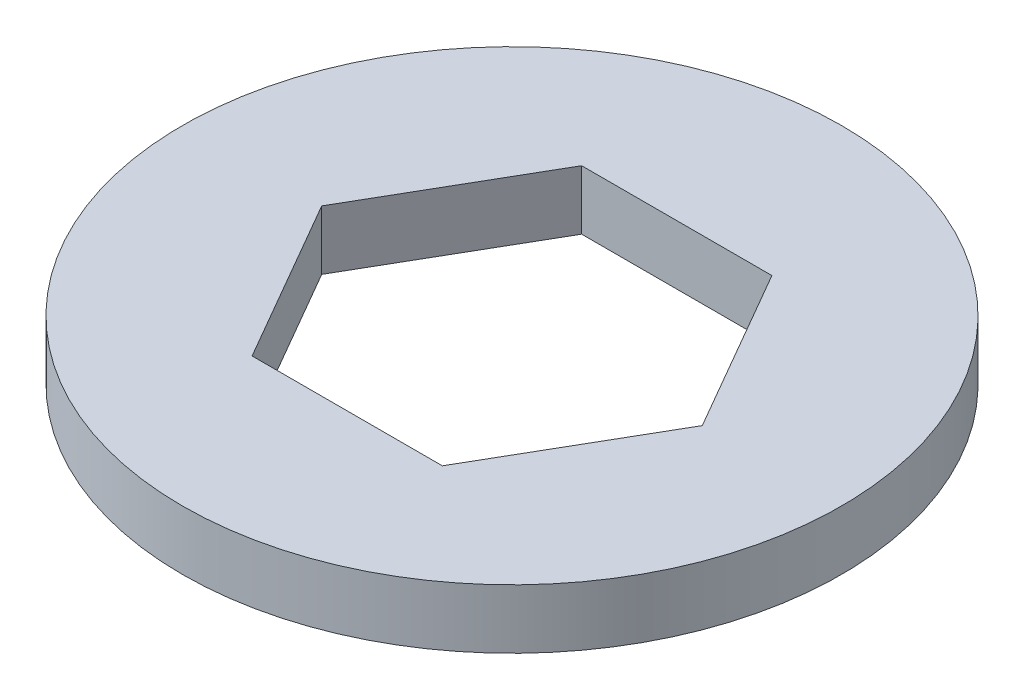
ISO-10303-21;
HEADER;
FILE_DESCRIPTION(('STEP AP214'),'2;1');
FILE_NAME('part.step','',(''),(''),'','','');
FILE_SCHEMA(('AUTOMOTIVE_DESIGN { 1 0 10303 214 1 1 1 1 }'));
ENDSEC;
DATA;
#1=APPLICATION_CONTEXT('core data for automotive mechanical design processes');
#2=APPLICATION_PROTOCOL_DEFINITION('international standard','automotive_design',2000,#1);
#3=PRODUCT_CONTEXT('',#1,'mechanical');
#4=PRODUCT('Part','Part','',(#3));
#5=PRODUCT_RELATED_PRODUCT_CATEGORY('part','',(#4));
#6=PRODUCT_DEFINITION_FORMATION('','',#4);
#7=PRODUCT_DEFINITION_CONTEXT('part definition',#1,'design');
#8=PRODUCT_DEFINITION('design','',#6,#7);
#9=PRODUCT_DEFINITION_SHAPE('','',#8);
#10=(LENGTH_UNIT() NAMED_UNIT(*) SI_UNIT(.MILLI.,.METRE.));
#11=(NAMED_UNIT(*) PLANE_ANGLE_UNIT() SI_UNIT($,.RADIAN.));
#12=(NAMED_UNIT(*) SI_UNIT($,.STERADIAN.) SOLID_ANGLE_UNIT());
#13=UNCERTAINTY_MEASURE_WITH_UNIT(LENGTH_MEASURE(1.E-05),#10,'distance_accuracy_value','');
#14=(GEOMETRIC_REPRESENTATION_CONTEXT(3) GLOBAL_UNCERTAINTY_ASSIGNED_CONTEXT((#13)) GLOBAL_UNIT_ASSIGNED_CONTEXT((#10,
#11,#12)) REPRESENTATION_CONTEXT('',''));
#15=CARTESIAN_POINT('',(0.,0.,0.));
#16=DIRECTION('',(0.,0.,1.));
#17=DIRECTION('',(1.,0.,0.));
#18=AXIS2_PLACEMENT_3D('',#15,#16,#17);
#19=CARTESIAN_POINT('',(0.,1.143,0.));
#20=DIRECTION('',(0.,1.,0.));
#21=DIRECTION('',(0.,0.,1.));
#22=AXIS2_PLACEMENT_3D('',#19,#20,#21);
#23=PLANE('',#22);
#24=CARTESIAN_POINT('',(0.,1.143,0.));
#25=DIRECTION('',(0.,1.,0.));
#26=DIRECTION('',(0.,0.,1.));
#27=AXIS2_PLACEMENT_3D('',#24,#25,#26);
#28=CIRCLE('',#27,12.7);
#29=CARTESIAN_POINT('',(0.,1.143,12.7));
#30=VERTEX_POINT('',#29);
#31=EDGE_CURVE('E11',#30,#30,#28,.T.);
#32=ORIENTED_EDGE('',*,*,#31,.T.);
#33=EDGE_LOOP('',(#32));
#34=FACE_BOUND('',#33,.T.);
#35=DIRECTION('',(-1.,0.,0.));
#36=VECTOR('',#35,1.);
#37=CARTESIAN_POINT('',(3.66617420935412,1.143,-6.35));
#38=LINE('',#37,#36);
#39=CARTESIAN_POINT('',(3.66617420935412,1.143,-6.35));
#40=VERTEX_POINT('',#39);
#41=CARTESIAN_POINT('',(-3.66617420935412,1.143,-6.35));
#42=VERTEX_POINT('',#41);
#43=EDGE_CURVE('E100',#40,#42,#38,.T.);
#44=ORIENTED_EDGE('',*,*,#43,.F.);
#45=DIRECTION('',(-0.5,0.,-0.866025403784438));
#46=VECTOR('',#45,1.);
#47=CARTESIAN_POINT('',(7.33234841870825,1.143,0.));
#48=LINE('',#47,#46);
#49=CARTESIAN_POINT('',(7.33234841870825,1.143,0.));
#50=VERTEX_POINT('',#49);
#51=EDGE_CURVE('E92',#50,#40,#48,.T.);
#52=ORIENTED_EDGE('',*,*,#51,.F.);
#53=DIRECTION('',(0.5,0.,-0.866025403784439));
#54=VECTOR('',#53,1.);
#55=CARTESIAN_POINT('',(3.66617420935412,1.143,6.35));
#56=LINE('',#55,#54);
#57=CARTESIAN_POINT('',(3.66617420935413,1.143,6.35));
#58=VERTEX_POINT('',#57);
#59=EDGE_CURVE('E120',#58,#50,#56,.T.);
#60=ORIENTED_EDGE('',*,*,#59,.F.);
#61=DIRECTION('',(1.,0.,0.));
#62=VECTOR('',#61,1.);
#63=CARTESIAN_POINT('',(-3.66617420935412,1.143,6.35));
#64=LINE('',#63,#62);
#65=CARTESIAN_POINT('',(-3.66617420935412,1.143,6.35));
#66=VERTEX_POINT('',#65);
#67=EDGE_CURVE('E118',#66,#58,#64,.T.);
#68=ORIENTED_EDGE('',*,*,#67,.F.);
#69=DIRECTION('',(0.5,0.,0.866025403784438));
#70=VECTOR('',#69,1.);
#71=CARTESIAN_POINT('',(-7.33234841870825,1.143,0.));
#72=LINE('',#71,#70);
#73=CARTESIAN_POINT('',(-7.33234841870825,1.143,0.));
#74=VERTEX_POINT('',#73);
#75=EDGE_CURVE('E114',#74,#66,#72,.T.);
#76=ORIENTED_EDGE('',*,*,#75,.F.);
#77=DIRECTION('',(-0.5,0.,0.866025403784439));
#78=VECTOR('',#77,1.);
#79=CARTESIAN_POINT('',(-3.66617420935412,1.143,-6.35));
#80=LINE('',#79,#78);
#81=EDGE_CURVE('E112',#42,#74,#80,.T.);
#82=ORIENTED_EDGE('',*,*,#81,.F.);
#83=EDGE_LOOP('',(#44,#52,#60,#68,#76,#82));
#84=FACE_BOUND('',#83,.T.);
#85=ADVANCED_FACE('F39',(#34,#84),#23,.T.);
#86=CARTESIAN_POINT('',(0.,-1.143,0.));
#87=DIRECTION('',(0.,1.,0.));
#88=DIRECTION('',(0.,0.,1.));
#89=AXIS2_PLACEMENT_3D('',#86,#87,#88);
#90=PLANE('',#89);
#91=CARTESIAN_POINT('',(0.,-1.143,0.));
#92=DIRECTION('',(0.,1.,0.));
#93=DIRECTION('',(0.,0.,1.));
#94=AXIS2_PLACEMENT_3D('',#91,#92,#93);
#95=CIRCLE('',#94,12.7);
#96=CARTESIAN_POINT('',(0.,-1.143,12.7));
#97=VERTEX_POINT('',#96);
#98=EDGE_CURVE('E43',#97,#97,#95,.T.);
#99=ORIENTED_EDGE('',*,*,#98,.F.);
#100=EDGE_LOOP('',(#99));
#101=FACE_BOUND('',#100,.T.);
#102=DIRECTION('',(-0.5,0.,-0.866025403784438));
#103=VECTOR('',#102,1.);
#104=CARTESIAN_POINT('',(7.33234841870825,-1.143,0.));
#105=LINE('',#104,#103);
#106=CARTESIAN_POINT('',(7.33234841870825,-1.143,0.));
#107=VERTEX_POINT('',#106);
#108=CARTESIAN_POINT('',(3.66617420935412,-1.143,-6.35));
#109=VERTEX_POINT('',#108);
#110=EDGE_CURVE('E62',#107,#109,#105,.T.);
#111=ORIENTED_EDGE('',*,*,#110,.T.);
#112=DIRECTION('',(-1.,0.,0.));
#113=VECTOR('',#112,1.);
#114=CARTESIAN_POINT('',(3.66617420935412,-1.143,-6.35));
#115=LINE('',#114,#113);
#116=CARTESIAN_POINT('',(-3.66617420935412,-1.143,-6.35));
#117=VERTEX_POINT('',#116);
#118=EDGE_CURVE('E107',#109,#117,#115,.T.);
#119=ORIENTED_EDGE('',*,*,#118,.T.);
#120=DIRECTION('',(-0.5,0.,0.866025403784439));
#121=VECTOR('',#120,1.);
#122=CARTESIAN_POINT('',(-3.66617420935412,-1.143,-6.35));
#123=LINE('',#122,#121);
#124=CARTESIAN_POINT('',(-7.33234841870825,-1.143,0.));
#125=VERTEX_POINT('',#124);
#126=EDGE_CURVE('E124',#117,#125,#123,.T.);
#127=ORIENTED_EDGE('',*,*,#126,.T.);
#128=DIRECTION('',(0.5,0.,0.866025403784438));
#129=VECTOR('',#128,1.);
#130=CARTESIAN_POINT('',(-7.33234841870825,-1.143,0.));
#131=LINE('',#130,#129);
#132=CARTESIAN_POINT('',(-3.66617420935412,-1.143,6.35));
#133=VERTEX_POINT('',#132);
#134=EDGE_CURVE('E127',#125,#133,#131,.T.);
#135=ORIENTED_EDGE('',*,*,#134,.T.);
#136=DIRECTION('',(1.,0.,0.));
#137=VECTOR('',#136,1.);
#138=CARTESIAN_POINT('',(-3.66617420935412,-1.143,6.35));
#139=LINE('',#138,#137);
#140=CARTESIAN_POINT('',(3.66617420935412,-1.143,6.35));
#141=VERTEX_POINT('',#140);
#142=EDGE_CURVE('E130',#133,#141,#139,.T.);
#143=ORIENTED_EDGE('',*,*,#142,.T.);
#144=DIRECTION('',(0.5,0.,-0.866025403784439));
#145=VECTOR('',#144,1.);
#146=CARTESIAN_POINT('',(3.66617420935412,-1.143,6.35));
#147=LINE('',#146,#145);
#148=EDGE_CURVE('E101',#141,#107,#147,.T.);
#149=ORIENTED_EDGE('',*,*,#148,.T.);
#150=EDGE_LOOP('',(#111,#119,#127,#135,#143,#149));
#151=FACE_BOUND('',#150,.T.);
#152=ADVANCED_FACE('F147',(#101,#151),#90,.F.);
#153=CARTESIAN_POINT('',(0.,1.143,0.));
#154=DIRECTION('',(0.,-1.,0.));
#155=DIRECTION('',(0.,0.,-1.));
#156=AXIS2_PLACEMENT_3D('',#153,#154,#155);
#157=CYLINDRICAL_SURFACE('',#156,12.7);
#158=ORIENTED_EDGE('',*,*,#31,.F.);
#159=EDGE_LOOP('',(#158));
#160=FACE_BOUND('',#159,.T.);
#161=ORIENTED_EDGE('',*,*,#98,.T.);
#162=EDGE_LOOP('',(#161));
#163=FACE_BOUND('',#162,.T.);
#164=ADVANCED_FACE('F41',(#160,#163),#157,.T.);
#165=CARTESIAN_POINT('',(7.33234841870825,1.143,0.));
#166=DIRECTION('',(-0.866025403784438,0.,0.5));
#167=DIRECTION('',(0.5,0.,0.866025403784439));
#168=AXIS2_PLACEMENT_3D('',#165,#166,#167);
#169=PLANE('',#168);
#170=ORIENTED_EDGE('',*,*,#110,.F.);
#171=DIRECTION('',(0.,-1.,0.));
#172=VECTOR('',#171,1.);
#173=CARTESIAN_POINT('',(7.33234841870825,1.143,0.));
#174=LINE('',#173,#172);
#175=EDGE_CURVE('E96',#50,#107,#174,.T.);
#176=ORIENTED_EDGE('',*,*,#175,.F.);
#177=ORIENTED_EDGE('',*,*,#51,.T.);
#178=DIRECTION('',(0.,-1.,0.));
#179=VECTOR('',#178,1.);
#180=CARTESIAN_POINT('',(3.66617420935412,1.143,-6.35));
#181=LINE('',#180,#179);
#182=EDGE_CURVE('E95',#40,#109,#181,.T.);
#183=ORIENTED_EDGE('',*,*,#182,.T.);
#184=EDGE_LOOP('',(#170,#176,#177,#183));
#185=FACE_BOUND('',#184,.T.);
#186=ADVANCED_FACE('F94',(#185),#169,.T.);
#187=CARTESIAN_POINT('',(3.66617420935412,1.143,-6.35));
#188=DIRECTION('',(0.,0.,1.));
#189=DIRECTION('',(1.,0.,0.));
#190=AXIS2_PLACEMENT_3D('',#187,#188,#189);
#191=PLANE('',#190);
#192=ORIENTED_EDGE('',*,*,#118,.F.);
#193=ORIENTED_EDGE('',*,*,#182,.F.);
#194=ORIENTED_EDGE('',*,*,#43,.T.);
#195=DIRECTION('',(0.,-1.,0.));
#196=VECTOR('',#195,1.);
#197=CARTESIAN_POINT('',(-3.66617420935412,1.143,-6.35));
#198=LINE('',#197,#196);
#199=EDGE_CURVE('E108',#42,#117,#198,.T.);
#200=ORIENTED_EDGE('',*,*,#199,.T.);
#201=EDGE_LOOP('',(#192,#193,#194,#200));
#202=FACE_BOUND('',#201,.T.);
#203=ADVANCED_FACE('F104',(#202),#191,.T.);
#204=CARTESIAN_POINT('',(-3.66617420935412,1.143,-6.35));
#205=DIRECTION('',(0.866025403784439,0.,0.5));
#206=DIRECTION('',(0.5,0.,-0.866025403784439));
#207=AXIS2_PLACEMENT_3D('',#204,#205,#206);
#208=PLANE('',#207);
#209=ORIENTED_EDGE('',*,*,#126,.F.);
#210=ORIENTED_EDGE('',*,*,#199,.F.);
#211=ORIENTED_EDGE('',*,*,#81,.T.);
#212=DIRECTION('',(0.,-1.,0.));
#213=VECTOR('',#212,1.);
#214=CARTESIAN_POINT('',(-7.33234841870825,1.143,0.));
#215=LINE('',#214,#213);
#216=EDGE_CURVE('E139',#74,#125,#215,.T.);
#217=ORIENTED_EDGE('',*,*,#216,.T.);
#218=EDGE_LOOP('',(#209,#210,#211,#217));
#219=FACE_BOUND('',#218,.T.);
#220=ADVANCED_FACE('F143',(#219),#208,.T.);
#221=CARTESIAN_POINT('',(-7.33234841870825,1.143,0.));
#222=DIRECTION('',(0.866025403784438,0.,-0.5));
#223=DIRECTION('',(-0.5,0.,-0.866025403784439));
#224=AXIS2_PLACEMENT_3D('',#221,#222,#223);
#225=PLANE('',#224);
#226=ORIENTED_EDGE('',*,*,#134,.F.);
#227=ORIENTED_EDGE('',*,*,#216,.F.);
#228=ORIENTED_EDGE('',*,*,#75,.T.);
#229=DIRECTION('',(0.,-1.,0.));
#230=VECTOR('',#229,1.);
#231=CARTESIAN_POINT('',(-3.66617420935412,1.143,6.35));
#232=LINE('',#231,#230);
#233=EDGE_CURVE('E137',#66,#133,#232,.T.);
#234=ORIENTED_EDGE('',*,*,#233,.T.);
#235=EDGE_LOOP('',(#226,#227,#228,#234));
#236=FACE_BOUND('',#235,.T.);
#237=ADVANCED_FACE('F155',(#236),#225,.T.);
#238=CARTESIAN_POINT('',(-3.66617420935412,1.143,6.35));
#239=DIRECTION('',(0.,0.,-1.));
#240=DIRECTION('',(-1.,0.,0.));
#241=AXIS2_PLACEMENT_3D('',#238,#239,#240);
#242=PLANE('',#241);
#243=ORIENTED_EDGE('',*,*,#142,.F.);
#244=ORIENTED_EDGE('',*,*,#233,.F.);
#245=ORIENTED_EDGE('',*,*,#67,.T.);
#246=DIRECTION('',(0.,-1.,0.));
#247=VECTOR('',#246,1.);
#248=CARTESIAN_POINT('',(3.66617420935412,1.143,6.35));
#249=LINE('',#248,#247);
#250=EDGE_CURVE('E54',#58,#141,#249,.T.);
#251=ORIENTED_EDGE('',*,*,#250,.T.);
#252=EDGE_LOOP('',(#243,#244,#245,#251));
#253=FACE_BOUND('',#252,.T.);
#254=ADVANCED_FACE('F153',(#253),#242,.T.);
#255=CARTESIAN_POINT('',(3.66617420935412,1.143,6.35));
#256=DIRECTION('',(-0.866025403784439,0.,-0.5));
#257=DIRECTION('',(-0.5,0.,0.866025403784439));
#258=AXIS2_PLACEMENT_3D('',#255,#256,#257);
#259=PLANE('',#258);
#260=ORIENTED_EDGE('',*,*,#148,.F.);
#261=ORIENTED_EDGE('',*,*,#250,.F.);
#262=ORIENTED_EDGE('',*,*,#59,.T.);
#263=ORIENTED_EDGE('',*,*,#175,.T.);
#264=EDGE_LOOP('',(#260,#261,#262,#263));
#265=FACE_BOUND('',#264,.T.);
#266=ADVANCED_FACE('F149',(#265),#259,.T.);
#267=CLOSED_SHELL('',(#85,#152,#164,#186,#203,#220,#237,#254,#266));
#268=MANIFOLD_SOLID_BREP('B2',#267);
#269=ADVANCED_BREP_SHAPE_REPRESENTATION('',(#18,#268),#14);
#270=SHAPE_DEFINITION_REPRESENTATION(#9,#269);
ENDSEC;
END-ISO-10303-21;
